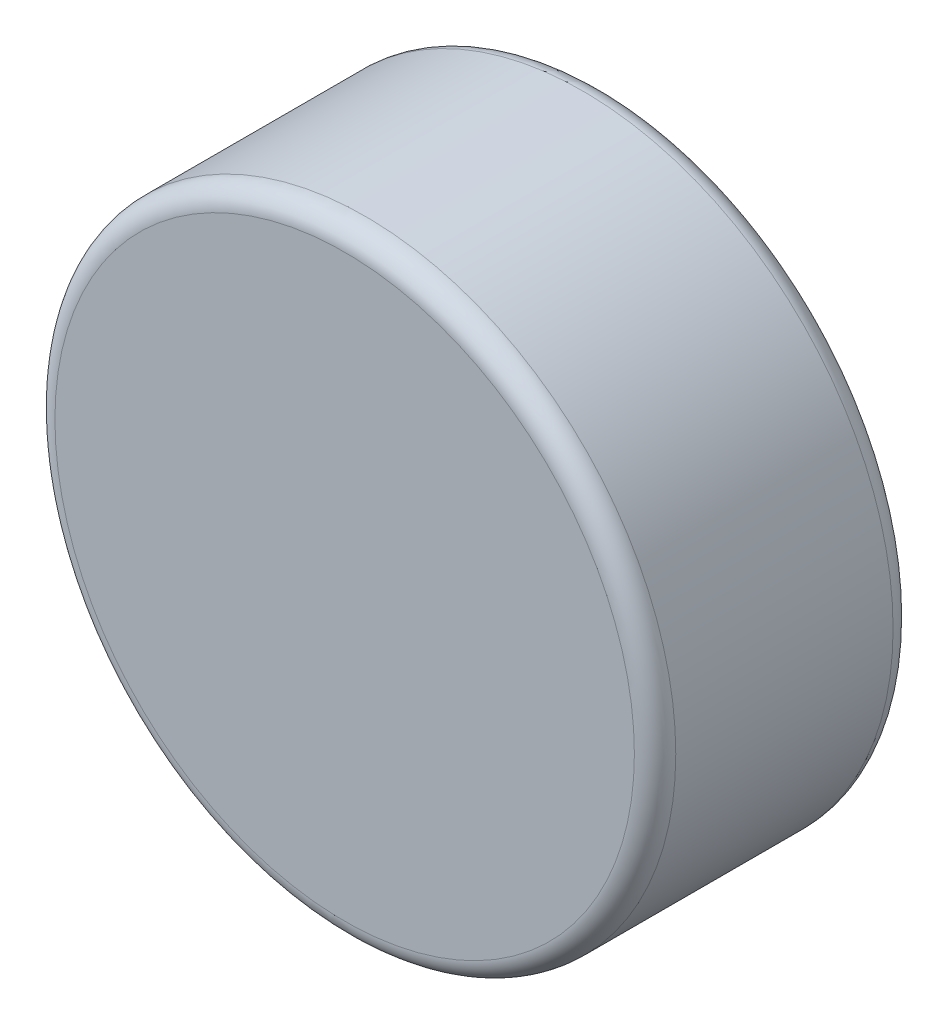
ISO-10303-21;
HEADER;
FILE_DESCRIPTION(('STEP AP214'),'2;1');
FILE_NAME('part.step','',(''),(''),'','','');
FILE_SCHEMA(('AUTOMOTIVE_DESIGN { 1 0 10303 214 1 1 1 1 }'));
ENDSEC;
DATA;
#1=APPLICATION_CONTEXT('core data for automotive mechanical design processes');
#2=APPLICATION_PROTOCOL_DEFINITION('international standard','automotive_design',2000,#1);
#3=PRODUCT_CONTEXT('',#1,'mechanical');
#4=PRODUCT('Part','Part','',(#3));
#5=PRODUCT_RELATED_PRODUCT_CATEGORY('part','',(#4));
#6=PRODUCT_DEFINITION_FORMATION('','',#4);
#7=PRODUCT_DEFINITION_CONTEXT('part definition',#1,'design');
#8=PRODUCT_DEFINITION('design','',#6,#7);
#9=PRODUCT_DEFINITION_SHAPE('','',#8);
#10=(LENGTH_UNIT() NAMED_UNIT(*) SI_UNIT(.MILLI.,.METRE.));
#11=(NAMED_UNIT(*) PLANE_ANGLE_UNIT() SI_UNIT($,.RADIAN.));
#12=(NAMED_UNIT(*) SI_UNIT($,.STERADIAN.) SOLID_ANGLE_UNIT());
#13=UNCERTAINTY_MEASURE_WITH_UNIT(LENGTH_MEASURE(1.E-05),#10,'distance_accuracy_value','');
#14=(GEOMETRIC_REPRESENTATION_CONTEXT(3) GLOBAL_UNCERTAINTY_ASSIGNED_CONTEXT((#13)) GLOBAL_UNIT_ASSIGNED_CONTEXT((#10,
#11,#12)) REPRESENTATION_CONTEXT('',''));
#15=CARTESIAN_POINT('',(0.,0.,0.));
#16=DIRECTION('',(0.,0.,1.));
#17=DIRECTION('',(1.,0.,0.));
#18=AXIS2_PLACEMENT_3D('',#15,#16,#17);
#19=CARTESIAN_POINT('',(0.,0.,2.5));
#20=DIRECTION('',(0.,0.,-1.));
#21=DIRECTION('',(-1.,0.,0.));
#22=AXIS2_PLACEMENT_3D('',#19,#20,#21);
#23=CYLINDRICAL_SURFACE('',#22,3.);
#24=CARTESIAN_POINT('',(0.,0.,2.3));
#25=DIRECTION('',(0.,0.,1.));
#26=DIRECTION('',(1.,0.,0.));
#27=AXIS2_PLACEMENT_3D('',#24,#25,#26);
#28=CIRCLE('',#27,3.);
#29=CARTESIAN_POINT('',(3.,0.,2.3));
#30=VERTEX_POINT('',#29);
#31=EDGE_CURVE('E39',#30,#30,#28,.F.);
#32=ORIENTED_EDGE('',*,*,#31,.T.);
#33=EDGE_LOOP('',(#32));
#34=FACE_BOUND('',#33,.T.);
#35=CARTESIAN_POINT('',(0.,0.,0.2));
#36=DIRECTION('',(0.,0.,1.));
#37=DIRECTION('',(1.,0.,0.));
#38=AXIS2_PLACEMENT_3D('',#35,#36,#37);
#39=CIRCLE('',#38,3.);
#40=CARTESIAN_POINT('',(3.,0.,0.2));
#41=VERTEX_POINT('',#40);
#42=EDGE_CURVE('E43',#41,#41,#39,.T.);
#43=ORIENTED_EDGE('',*,*,#42,.T.);
#44=EDGE_LOOP('',(#43));
#45=FACE_BOUND('',#44,.T.);
#46=ADVANCED_FACE('F32',(#34,#45),#23,.T.);
#47=CARTESIAN_POINT('',(0.,0.,2.5));
#48=DIRECTION('',(0.,0.,1.));
#49=DIRECTION('',(1.,0.,0.));
#50=AXIS2_PLACEMENT_3D('',#47,#48,#49);
#51=PLANE('',#50);
#52=CARTESIAN_POINT('',(0.,0.,2.5));
#53=DIRECTION('',(0.,0.,1.));
#54=DIRECTION('',(1.,0.,0.));
#55=AXIS2_PLACEMENT_3D('',#52,#53,#54);
#56=CIRCLE('',#55,2.8);
#57=CARTESIAN_POINT('',(2.8,0.,2.5));
#58=VERTEX_POINT('',#57);
#59=EDGE_CURVE('E47',#58,#58,#56,.T.);
#60=ORIENTED_EDGE('',*,*,#59,.T.);
#61=EDGE_LOOP('',(#60));
#62=FACE_BOUND('',#61,.T.);
#63=ADVANCED_FACE('F53',(#62),#51,.T.);
#64=CARTESIAN_POINT('',(0.,0.,0.));
#65=DIRECTION('',(0.,0.,1.));
#66=DIRECTION('',(1.,0.,0.));
#67=AXIS2_PLACEMENT_3D('',#64,#65,#66);
#68=PLANE('',#67);
#69=CARTESIAN_POINT('',(0.,0.,0.));
#70=DIRECTION('',(0.,0.,1.));
#71=DIRECTION('',(1.,0.,0.));
#72=AXIS2_PLACEMENT_3D('',#69,#70,#71);
#73=CIRCLE('',#72,2.8);
#74=CARTESIAN_POINT('',(2.8,0.,0.));
#75=VERTEX_POINT('',#74);
#76=EDGE_CURVE('E10',#75,#75,#73,.F.);
#77=ORIENTED_EDGE('',*,*,#76,.T.);
#78=EDGE_LOOP('',(#77));
#79=FACE_BOUND('',#78,.T.);
#80=ADVANCED_FACE('F57',(#79),#68,.F.);
#81=CARTESIAN_POINT('',(0.,0.,2.3));
#82=DIRECTION('',(0.,0.,1.));
#83=DIRECTION('',(1.,0.,0.));
#84=AXIS2_PLACEMENT_3D('',#81,#82,#83);
#85=TOROIDAL_SURFACE('',#84,2.8,0.2);
#86=ORIENTED_EDGE('',*,*,#31,.F.);
#87=EDGE_LOOP('',(#86));
#88=FACE_BOUND('',#87,.T.);
#89=ORIENTED_EDGE('',*,*,#59,.F.);
#90=EDGE_LOOP('',(#89));
#91=FACE_BOUND('',#90,.T.);
#92=ADVANCED_FACE('F55',(#88,#91),#85,.T.);
#93=CARTESIAN_POINT('',(0.,0.,0.2));
#94=DIRECTION('',(0.,0.,1.));
#95=DIRECTION('',(1.,0.,0.));
#96=AXIS2_PLACEMENT_3D('',#93,#94,#95);
#97=TOROIDAL_SURFACE('',#96,2.8,0.2);
#98=ORIENTED_EDGE('',*,*,#76,.F.);
#99=EDGE_LOOP('',(#98));
#100=FACE_BOUND('',#99,.T.);
#101=ORIENTED_EDGE('',*,*,#42,.F.);
#102=EDGE_LOOP('',(#101));
#103=FACE_BOUND('',#102,.T.);
#104=ADVANCED_FACE('F34',(#100,#103),#97,.T.);
#105=CLOSED_SHELL('',(#46,#63,#80,#92,#104));
#106=MANIFOLD_SOLID_BREP('B2',#105);
#107=ADVANCED_BREP_SHAPE_REPRESENTATION('',(#18,#106),#14);
#108=SHAPE_DEFINITION_REPRESENTATION(#9,#107);
ENDSEC;
END-ISO-10303-21;
